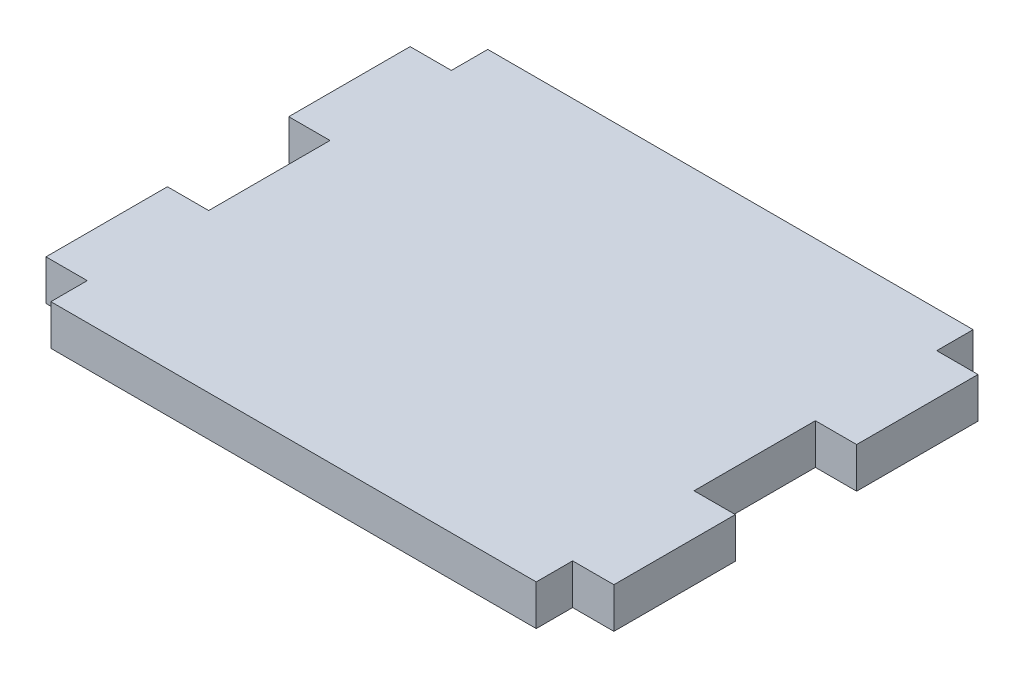
ISO-10303-21;
HEADER;
FILE_DESCRIPTION(('STEP AP214'),'2;1');
FILE_NAME('part.step','',(''),(''),'','','');
FILE_SCHEMA(('AUTOMOTIVE_DESIGN { 1 0 10303 214 1 1 1 1 }'));
ENDSEC;
DATA;
#1=APPLICATION_CONTEXT('core data for automotive mechanical design processes');
#2=APPLICATION_PROTOCOL_DEFINITION('international standard','automotive_design',2000,#1);
#3=PRODUCT_CONTEXT('',#1,'mechanical');
#4=PRODUCT('Part','Part','',(#3));
#5=PRODUCT_RELATED_PRODUCT_CATEGORY('part','',(#4));
#6=PRODUCT_DEFINITION_FORMATION('','',#4);
#7=PRODUCT_DEFINITION_CONTEXT('part definition',#1,'design');
#8=PRODUCT_DEFINITION('design','',#6,#7);
#9=PRODUCT_DEFINITION_SHAPE('','',#8);
#10=(LENGTH_UNIT() NAMED_UNIT(*) SI_UNIT(.MILLI.,.METRE.));
#11=(NAMED_UNIT(*) PLANE_ANGLE_UNIT() SI_UNIT($,.RADIAN.));
#12=(NAMED_UNIT(*) SI_UNIT($,.STERADIAN.) SOLID_ANGLE_UNIT());
#13=UNCERTAINTY_MEASURE_WITH_UNIT(LENGTH_MEASURE(1.E-05),#10,'distance_accuracy_value','');
#14=(GEOMETRIC_REPRESENTATION_CONTEXT(3) GLOBAL_UNCERTAINTY_ASSIGNED_CONTEXT((#13)) GLOBAL_UNIT_ASSIGNED_CONTEXT((#10,
#11,#12)) REPRESENTATION_CONTEXT('',''));
#15=CARTESIAN_POINT('',(0.,0.,0.));
#16=DIRECTION('',(0.,0.,1.));
#17=DIRECTION('',(1.,0.,0.));
#18=AXIS2_PLACEMENT_3D('',#15,#16,#17);
#19=CARTESIAN_POINT('',(70.2,0.,0.));
#20=DIRECTION('',(1.,0.,0.));
#21=DIRECTION('',(0.,0.,-1.));
#22=AXIS2_PLACEMENT_3D('',#19,#20,#21);
#23=PLANE('',#22);
#24=DIRECTION('',(0.,-1.,0.));
#25=VECTOR('',#24,1.);
#26=CARTESIAN_POINT('',(70.2,2.5,-7.50452554665607));
#27=LINE('',#26,#25);
#28=CARTESIAN_POINT('',(70.2,2.5,-7.50452554665607));
#29=VERTEX_POINT('',#28);
#30=CARTESIAN_POINT('',(70.2,-2.5,-7.50452554665607));
#31=VERTEX_POINT('',#30);
#32=EDGE_CURVE('E202',#29,#31,#27,.T.);
#33=ORIENTED_EDGE('',*,*,#32,.T.);
#34=DIRECTION('',(0.,0.,-1.));
#35=VECTOR('',#34,1.);
#36=CARTESIAN_POINT('',(70.2,-2.5,27.0045255466561));
#37=LINE('',#36,#35);
#38=CARTESIAN_POINT('',(70.2,-2.5,-22.5045255466561));
#39=VERTEX_POINT('',#38);
#40=EDGE_CURVE('E310',#31,#39,#37,.T.);
#41=ORIENTED_EDGE('',*,*,#40,.T.);
#42=DIRECTION('',(0.,-1.,0.));
#43=VECTOR('',#42,1.);
#44=CARTESIAN_POINT('',(70.2,2.5,-22.5045255466561));
#45=LINE('',#44,#43);
#46=CARTESIAN_POINT('',(70.2,2.5,-22.5045255466561));
#47=VERTEX_POINT('',#46);
#48=EDGE_CURVE('E183',#47,#39,#45,.T.);
#49=ORIENTED_EDGE('',*,*,#48,.F.);
#50=DIRECTION('',(0.,0.,1.));
#51=VECTOR('',#50,1.);
#52=CARTESIAN_POINT('',(70.2,2.5,27.0045255466561));
#53=LINE('',#52,#51);
#54=EDGE_CURVE('E197',#47,#29,#53,.T.);
#55=ORIENTED_EDGE('',*,*,#54,.T.);
#56=EDGE_LOOP('',(#33,#41,#49,#55));
#57=FACE_BOUND('',#56,.T.);
#58=ADVANCED_FACE('F36',(#57),#23,.T.);
#59=CARTESIAN_POINT('',(0.,0.,0.));
#60=DIRECTION('',(1.,0.,0.));
#61=DIRECTION('',(0.,0.,-1.));
#62=AXIS2_PLACEMENT_3D('',#59,#60,#61);
#63=PLANE('',#62);
#64=DIRECTION('',(0.,0.,-1.));
#65=VECTOR('',#64,1.);
#66=CARTESIAN_POINT('',(0.,-2.5,27.0045255466561));
#67=LINE('',#66,#65);
#68=CARTESIAN_POINT('',(0.,-2.5,-7.50452554665607));
#69=VERTEX_POINT('',#68);
#70=CARTESIAN_POINT('',(0.,-2.5,-22.5045255466561));
#71=VERTEX_POINT('',#70);
#72=EDGE_CURVE('E317',#69,#71,#67,.T.);
#73=ORIENTED_EDGE('',*,*,#72,.F.);
#74=DIRECTION('',(0.,-1.,0.));
#75=VECTOR('',#74,1.);
#76=CARTESIAN_POINT('',(0.,2.5,-7.50452554665607));
#77=LINE('',#76,#75);
#78=CARTESIAN_POINT('',(0.,2.5,-7.50452554665607));
#79=VERTEX_POINT('',#78);
#80=EDGE_CURVE('E268',#79,#69,#77,.T.);
#81=ORIENTED_EDGE('',*,*,#80,.F.);
#82=DIRECTION('',(0.,0.,1.));
#83=VECTOR('',#82,1.);
#84=CARTESIAN_POINT('',(0.,2.5,27.0045255466561));
#85=LINE('',#84,#83);
#86=CARTESIAN_POINT('',(0.,2.5,-22.5045255466561));
#87=VERTEX_POINT('',#86);
#88=EDGE_CURVE('E316',#87,#79,#85,.T.);
#89=ORIENTED_EDGE('',*,*,#88,.F.);
#90=DIRECTION('',(0.,-1.,0.));
#91=VECTOR('',#90,1.);
#92=CARTESIAN_POINT('',(0.,2.5,-22.5045255466561));
#93=LINE('',#92,#91);
#94=EDGE_CURVE('E244',#87,#71,#93,.T.);
#95=ORIENTED_EDGE('',*,*,#94,.T.);
#96=EDGE_LOOP('',(#73,#81,#89,#95));
#97=FACE_BOUND('',#96,.T.);
#98=ADVANCED_FACE('F375',(#97),#63,.F.);
#99=CARTESIAN_POINT('',(70.2,2.5,-27.0045255466561));
#100=DIRECTION('',(0.,0.,1.));
#101=DIRECTION('',(1.,0.,0.));
#102=AXIS2_PLACEMENT_3D('',#99,#100,#101);
#103=PLANE('',#102);
#104=DIRECTION('',(-1.,0.,0.));
#105=VECTOR('',#104,1.);
#106=CARTESIAN_POINT('',(70.2,-2.5,-27.0045255466561));
#107=LINE('',#106,#105);
#108=CARTESIAN_POINT('',(65.1,-2.5,-27.0045255466561));
#109=VERTEX_POINT('',#108);
#110=CARTESIAN_POINT('',(5.09999999999999,-2.5,-27.0045255466561));
#111=VERTEX_POINT('',#110);
#112=EDGE_CURVE('E320',#109,#111,#107,.T.);
#113=ORIENTED_EDGE('',*,*,#112,.T.);
#114=DIRECTION('',(0.,-1.,0.));
#115=VECTOR('',#114,1.);
#116=CARTESIAN_POINT('',(5.09999999999999,2.5,-27.0045255466561));
#117=LINE('',#116,#115);
#118=CARTESIAN_POINT('',(5.09999999999999,2.5,-27.0045255466561));
#119=VERTEX_POINT('',#118);
#120=EDGE_CURVE('E219',#119,#111,#117,.T.);
#121=ORIENTED_EDGE('',*,*,#120,.F.);
#122=DIRECTION('',(-1.,0.,0.));
#123=VECTOR('',#122,1.);
#124=CARTESIAN_POINT('',(70.2,2.5,-27.0045255466561));
#125=LINE('',#124,#123);
#126=CARTESIAN_POINT('',(65.1,2.5,-27.0045255466561));
#127=VERTEX_POINT('',#126);
#128=EDGE_CURVE('E11',#127,#119,#125,.T.);
#129=ORIENTED_EDGE('',*,*,#128,.F.);
#130=DIRECTION('',(0.,-1.,0.));
#131=VECTOR('',#130,1.);
#132=CARTESIAN_POINT('',(65.1,2.5,-27.0045255466561));
#133=LINE('',#132,#131);
#134=EDGE_CURVE('E182',#127,#109,#133,.T.);
#135=ORIENTED_EDGE('',*,*,#134,.T.);
#136=EDGE_LOOP('',(#113,#121,#129,#135));
#137=FACE_BOUND('',#136,.T.);
#138=ADVANCED_FACE('F38',(#137),#103,.F.);
#139=CARTESIAN_POINT('',(70.2,2.5,27.0045255466561));
#140=DIRECTION('',(0.,-1.,0.));
#141=DIRECTION('',(0.,0.,-1.));
#142=AXIS2_PLACEMENT_3D('',#139,#140,#141);
#143=PLANE('',#142);
#144=DIRECTION('',(1.,0.,0.));
#145=VECTOR('',#144,1.);
#146=CARTESIAN_POINT('',(5.09999999999999,2.5,22.5045255466561));
#147=LINE('',#146,#145);
#148=CARTESIAN_POINT('',(0.,2.5,22.5045255466561));
#149=VERTEX_POINT('',#148);
#150=CARTESIAN_POINT('',(5.09999999999999,2.5,22.5045255466561));
#151=VERTEX_POINT('',#150);
#152=EDGE_CURVE('E274',#149,#151,#147,.T.);
#153=ORIENTED_EDGE('',*,*,#152,.T.);
#154=DIRECTION('',(0.,0.,1.));
#155=VECTOR('',#154,1.);
#156=CARTESIAN_POINT('',(5.09999999999999,2.5,27.0045255466561));
#157=LINE('',#156,#155);
#158=CARTESIAN_POINT('',(5.09999999999999,2.5,27.0045255466561));
#159=VERTEX_POINT('',#158);
#160=EDGE_CURVE('E276',#151,#159,#157,.T.);
#161=ORIENTED_EDGE('',*,*,#160,.T.);
#162=DIRECTION('',(-1.,0.,0.));
#163=VECTOR('',#162,1.);
#164=CARTESIAN_POINT('',(70.2,2.5,27.0045255466561));
#165=LINE('',#164,#163);
#166=CARTESIAN_POINT('',(65.1,2.5,27.0045255466561));
#167=VERTEX_POINT('',#166);
#168=EDGE_CURVE('E44',#167,#159,#165,.T.);
#169=ORIENTED_EDGE('',*,*,#168,.F.);
#170=DIRECTION('',(0.,0.,-1.));
#171=VECTOR('',#170,1.);
#172=CARTESIAN_POINT('',(65.1,2.5,27.0045255466561));
#173=LINE('',#172,#171);
#174=CARTESIAN_POINT('',(65.1,2.5,22.5045255466561));
#175=VERTEX_POINT('',#174);
#176=EDGE_CURVE('E290',#167,#175,#173,.T.);
#177=ORIENTED_EDGE('',*,*,#176,.T.);
#178=DIRECTION('',(1.,0.,0.));
#179=VECTOR('',#178,1.);
#180=CARTESIAN_POINT('',(65.1,2.5,22.5045255466561));
#181=LINE('',#180,#179);
#182=CARTESIAN_POINT('',(70.2,2.5,22.5045255466561));
#183=VERTEX_POINT('',#182);
#184=EDGE_CURVE('E293',#175,#183,#181,.T.);
#185=ORIENTED_EDGE('',*,*,#184,.T.);
#186=CARTESIAN_POINT('',(70.2,2.5,7.49547445334393));
#187=VERTEX_POINT('',#186);
#188=EDGE_CURVE('E306',#187,#183,#53,.T.);
#189=ORIENTED_EDGE('',*,*,#188,.F.);
#190=DIRECTION('',(-1.,0.,0.));
#191=VECTOR('',#190,1.);
#192=CARTESIAN_POINT('',(70.2,2.5,7.49547445334393));
#193=LINE('',#192,#191);
#194=CARTESIAN_POINT('',(65.1,2.5,7.49547445334393));
#195=VERTEX_POINT('',#194);
#196=EDGE_CURVE('E59',#187,#195,#193,.T.);
#197=ORIENTED_EDGE('',*,*,#196,.T.);
#198=DIRECTION('',(0.,0.,-1.));
#199=VECTOR('',#198,1.);
#200=CARTESIAN_POINT('',(65.1,2.5,7.49547445334393));
#201=LINE('',#200,#199);
#202=CARTESIAN_POINT('',(65.1,2.5,-7.50452554665606));
#203=VERTEX_POINT('',#202);
#204=EDGE_CURVE('E208',#195,#203,#201,.T.);
#205=ORIENTED_EDGE('',*,*,#204,.T.);
#206=DIRECTION('',(1.,0.,0.));
#207=VECTOR('',#206,1.);
#208=CARTESIAN_POINT('',(65.1,2.5,-7.50452554665606));
#209=LINE('',#208,#207);
#210=EDGE_CURVE('E212',#203,#29,#209,.T.);
#211=ORIENTED_EDGE('',*,*,#210,.T.);
#212=ORIENTED_EDGE('',*,*,#54,.F.);
#213=DIRECTION('',(-1.,0.,0.));
#214=VECTOR('',#213,1.);
#215=CARTESIAN_POINT('',(65.1,2.5,-22.5045255466561));
#216=LINE('',#215,#214);
#217=CARTESIAN_POINT('',(65.1,2.5,-22.5045255466561));
#218=VERTEX_POINT('',#217);
#219=EDGE_CURVE('E176',#47,#218,#216,.T.);
#220=ORIENTED_EDGE('',*,*,#219,.T.);
#221=DIRECTION('',(0.,0.,-1.));
#222=VECTOR('',#221,1.);
#223=CARTESIAN_POINT('',(65.1,2.5,-27.0045255466561));
#224=LINE('',#223,#222);
#225=EDGE_CURVE('E186',#218,#127,#224,.T.);
#226=ORIENTED_EDGE('',*,*,#225,.T.);
#227=ORIENTED_EDGE('',*,*,#128,.T.);
#228=DIRECTION('',(0.,0.,1.));
#229=VECTOR('',#228,1.);
#230=CARTESIAN_POINT('',(5.09999999999999,2.5,-27.0045255466561));
#231=LINE('',#230,#229);
#232=CARTESIAN_POINT('',(5.09999999999999,2.5,-22.5045255466561));
#233=VERTEX_POINT('',#232);
#234=EDGE_CURVE('E230',#119,#233,#231,.T.);
#235=ORIENTED_EDGE('',*,*,#234,.T.);
#236=DIRECTION('',(-1.,0.,0.));
#237=VECTOR('',#236,1.);
#238=CARTESIAN_POINT('',(5.09999999999999,2.5,-22.5045255466561));
#239=LINE('',#238,#237);
#240=EDGE_CURVE('E233',#233,#87,#239,.T.);
#241=ORIENTED_EDGE('',*,*,#240,.T.);
#242=ORIENTED_EDGE('',*,*,#88,.T.);
#243=DIRECTION('',(1.,0.,0.));
#244=VECTOR('',#243,1.);
#245=CARTESIAN_POINT('',(5.09999999999999,2.5,-7.50452554665606));
#246=LINE('',#245,#244);
#247=CARTESIAN_POINT('',(5.09999999999999,2.5,-7.50452554665606));
#248=VERTEX_POINT('',#247);
#249=EDGE_CURVE('E255',#79,#248,#246,.T.);
#250=ORIENTED_EDGE('',*,*,#249,.T.);
#251=DIRECTION('',(0.,0.,1.));
#252=VECTOR('',#251,1.);
#253=CARTESIAN_POINT('',(5.09999999999999,2.5,7.49547445334393));
#254=LINE('',#253,#252);
#255=CARTESIAN_POINT('',(5.09999999999999,2.5,7.49547445334393));
#256=VERTEX_POINT('',#255);
#257=EDGE_CURVE('E248',#248,#256,#254,.T.);
#258=ORIENTED_EDGE('',*,*,#257,.T.);
#259=DIRECTION('',(-1.,0.,0.));
#260=VECTOR('',#259,1.);
#261=CARTESIAN_POINT('',(0.,2.5,7.49547445334393));
#262=LINE('',#261,#260);
#263=CARTESIAN_POINT('',(0.,2.5,7.49547445334393));
#264=VERTEX_POINT('',#263);
#265=EDGE_CURVE('E251',#256,#264,#262,.T.);
#266=ORIENTED_EDGE('',*,*,#265,.T.);
#267=EDGE_CURVE('E302',#264,#149,#85,.T.);
#268=ORIENTED_EDGE('',*,*,#267,.T.);
#269=EDGE_LOOP('',(#153,#161,#169,#177,#185,#189,#197,#205,#211,#212,#220,#226,#227,#235,#241,
#242,#250,#258,#266,#268));
#270=FACE_BOUND('',#269,.T.);
#271=ADVANCED_FACE('F194',(#270),#143,.F.);
#272=CARTESIAN_POINT('',(70.2,2.5,27.0045255466561));
#273=DIRECTION('',(0.,0.,-1.));
#274=DIRECTION('',(-1.,0.,0.));
#275=AXIS2_PLACEMENT_3D('',#272,#273,#274);
#276=PLANE('',#275);
#277=ORIENTED_EDGE('',*,*,#168,.T.);
#278=DIRECTION('',(0.,-1.,0.));
#279=VECTOR('',#278,1.);
#280=CARTESIAN_POINT('',(5.09999999999999,2.5,27.0045255466561));
#281=LINE('',#280,#279);
#282=CARTESIAN_POINT('',(5.09999999999999,-2.5,27.0045255466561));
#283=VERTEX_POINT('',#282);
#284=EDGE_CURVE('E263',#159,#283,#281,.T.);
#285=ORIENTED_EDGE('',*,*,#284,.T.);
#286=DIRECTION('',(-1.,0.,0.));
#287=VECTOR('',#286,1.);
#288=CARTESIAN_POINT('',(70.2,-2.5,27.0045255466561));
#289=LINE('',#288,#287);
#290=CARTESIAN_POINT('',(65.1,-2.5,27.0045255466561));
#291=VERTEX_POINT('',#290);
#292=EDGE_CURVE('E323',#291,#283,#289,.T.);
#293=ORIENTED_EDGE('',*,*,#292,.F.);
#294=DIRECTION('',(0.,-1.,0.));
#295=VECTOR('',#294,1.);
#296=CARTESIAN_POINT('',(65.1,2.5,27.0045255466561));
#297=LINE('',#296,#295);
#298=EDGE_CURVE('E296',#167,#291,#297,.T.);
#299=ORIENTED_EDGE('',*,*,#298,.F.);
#300=EDGE_LOOP('',(#277,#285,#293,#299));
#301=FACE_BOUND('',#300,.T.);
#302=ADVANCED_FACE('F329',(#301),#276,.F.);
#303=CARTESIAN_POINT('',(70.2,-2.5,27.0045255466561));
#304=DIRECTION('',(0.,1.,0.));
#305=DIRECTION('',(0.,0.,1.));
#306=AXIS2_PLACEMENT_3D('',#303,#304,#305);
#307=PLANE('',#306);
#308=ORIENTED_EDGE('',*,*,#292,.T.);
#309=DIRECTION('',(0.,0.,1.));
#310=VECTOR('',#309,1.);
#311=CARTESIAN_POINT('',(5.09999999999999,-2.5,27.0045255466561));
#312=LINE('',#311,#310);
#313=CARTESIAN_POINT('',(5.09999999999999,-2.5,22.5045255466561));
#314=VERTEX_POINT('',#313);
#315=EDGE_CURVE('E277',#314,#283,#312,.T.);
#316=ORIENTED_EDGE('',*,*,#315,.F.);
#317=DIRECTION('',(1.,0.,0.));
#318=VECTOR('',#317,1.);
#319=CARTESIAN_POINT('',(5.09999999999999,-2.5,22.5045255466561));
#320=LINE('',#319,#318);
#321=CARTESIAN_POINT('',(0.,-2.5,22.5045255466561));
#322=VERTEX_POINT('',#321);
#323=EDGE_CURVE('E281',#322,#314,#320,.T.);
#324=ORIENTED_EDGE('',*,*,#323,.F.);
#325=CARTESIAN_POINT('',(0.,-2.5,7.49547445334393));
#326=VERTEX_POINT('',#325);
#327=EDGE_CURVE('E309',#322,#326,#67,.T.);
#328=ORIENTED_EDGE('',*,*,#327,.T.);
#329=DIRECTION('',(-1.,0.,0.));
#330=VECTOR('',#329,1.);
#331=CARTESIAN_POINT('',(0.,-2.5,7.49547445334393));
#332=LINE('',#331,#330);
#333=CARTESIAN_POINT('',(5.09999999999999,-2.5,7.49547445334393));
#334=VERTEX_POINT('',#333);
#335=EDGE_CURVE('E262',#334,#326,#332,.T.);
#336=ORIENTED_EDGE('',*,*,#335,.F.);
#337=DIRECTION('',(0.,0.,1.));
#338=VECTOR('',#337,1.);
#339=CARTESIAN_POINT('',(5.09999999999999,-2.5,7.49547445334393));
#340=LINE('',#339,#338);
#341=CARTESIAN_POINT('',(5.09999999999999,-2.5,-7.50452554665606));
#342=VERTEX_POINT('',#341);
#343=EDGE_CURVE('E259',#342,#334,#340,.T.);
#344=ORIENTED_EDGE('',*,*,#343,.F.);
#345=DIRECTION('',(1.,0.,0.));
#346=VECTOR('',#345,1.);
#347=CARTESIAN_POINT('',(5.09999999999999,-2.5,-7.50452554665606));
#348=LINE('',#347,#346);
#349=EDGE_CURVE('E252',#69,#342,#348,.T.);
#350=ORIENTED_EDGE('',*,*,#349,.F.);
#351=ORIENTED_EDGE('',*,*,#72,.T.);
#352=DIRECTION('',(-1.,0.,0.));
#353=VECTOR('',#352,1.);
#354=CARTESIAN_POINT('',(5.09999999999999,-2.5,-22.5045255466561));
#355=LINE('',#354,#353);
#356=CARTESIAN_POINT('',(5.09999999999999,-2.5,-22.5045255466561));
#357=VERTEX_POINT('',#356);
#358=EDGE_CURVE('E234',#357,#71,#355,.T.);
#359=ORIENTED_EDGE('',*,*,#358,.F.);
#360=DIRECTION('',(0.,0.,1.));
#361=VECTOR('',#360,1.);
#362=CARTESIAN_POINT('',(5.09999999999999,-2.5,-27.0045255466561));
#363=LINE('',#362,#361);
#364=EDGE_CURVE('E238',#111,#357,#363,.T.);
#365=ORIENTED_EDGE('',*,*,#364,.F.);
#366=ORIENTED_EDGE('',*,*,#112,.F.);
#367=DIRECTION('',(0.,0.,-1.));
#368=VECTOR('',#367,1.);
#369=CARTESIAN_POINT('',(65.1,-2.5,-27.0045255466561));
#370=LINE('',#369,#368);
#371=CARTESIAN_POINT('',(65.1,-2.5,-22.5045255466561));
#372=VERTEX_POINT('',#371);
#373=EDGE_CURVE('E198',#372,#109,#370,.T.);
#374=ORIENTED_EDGE('',*,*,#373,.F.);
#375=DIRECTION('',(-1.,0.,0.));
#376=VECTOR('',#375,1.);
#377=CARTESIAN_POINT('',(65.1,-2.5,-22.5045255466561));
#378=LINE('',#377,#376);
#379=EDGE_CURVE('E179',#39,#372,#378,.T.);
#380=ORIENTED_EDGE('',*,*,#379,.F.);
#381=ORIENTED_EDGE('',*,*,#40,.F.);
#382=DIRECTION('',(1.,0.,0.));
#383=VECTOR('',#382,1.);
#384=CARTESIAN_POINT('',(65.1,-2.5,-7.50452554665606));
#385=LINE('',#384,#383);
#386=CARTESIAN_POINT('',(65.1,-2.5,-7.50452554665606));
#387=VERTEX_POINT('',#386);
#388=EDGE_CURVE('E209',#387,#31,#385,.T.);
#389=ORIENTED_EDGE('',*,*,#388,.F.);
#390=DIRECTION('',(0.,0.,-1.));
#391=VECTOR('',#390,1.);
#392=CARTESIAN_POINT('',(65.1,-2.5,7.49547445334393));
#393=LINE('',#392,#391);
#394=CARTESIAN_POINT('',(65.1,-2.5,7.49547445334393));
#395=VERTEX_POINT('',#394);
#396=EDGE_CURVE('E218',#395,#387,#393,.T.);
#397=ORIENTED_EDGE('',*,*,#396,.F.);
#398=DIRECTION('',(-1.,0.,0.));
#399=VECTOR('',#398,1.);
#400=CARTESIAN_POINT('',(70.2,-2.5,7.49547445334393));
#401=LINE('',#400,#399);
#402=CARTESIAN_POINT('',(70.2,-2.5,7.49547445334393));
#403=VERTEX_POINT('',#402);
#404=EDGE_CURVE('E215',#403,#395,#401,.T.);
#405=ORIENTED_EDGE('',*,*,#404,.F.);
#406=CARTESIAN_POINT('',(70.2,-2.5,22.5045255466561));
#407=VERTEX_POINT('',#406);
#408=EDGE_CURVE('E313',#407,#403,#37,.T.);
#409=ORIENTED_EDGE('',*,*,#408,.F.);
#410=DIRECTION('',(1.,0.,0.));
#411=VECTOR('',#410,1.);
#412=CARTESIAN_POINT('',(65.1,-2.5,22.5045255466561));
#413=LINE('',#412,#411);
#414=CARTESIAN_POINT('',(65.1,-2.5,22.5045255466561));
#415=VERTEX_POINT('',#414);
#416=EDGE_CURVE('E51',#415,#407,#413,.T.);
#417=ORIENTED_EDGE('',*,*,#416,.F.);
#418=DIRECTION('',(0.,0.,-1.));
#419=VECTOR('',#418,1.);
#420=CARTESIAN_POINT('',(65.1,-2.5,27.0045255466561));
#421=LINE('',#420,#419);
#422=EDGE_CURVE('E204',#291,#415,#421,.T.);
#423=ORIENTED_EDGE('',*,*,#422,.F.);
#424=EDGE_LOOP('',(#308,#316,#324,#328,#336,#344,#350,#351,#359,#365,#366,#374,#380,#381,#389,
#397,#405,#409,#417,#423));
#425=FACE_BOUND('',#424,.T.);
#426=ADVANCED_FACE('F337',(#425),#307,.F.);
#427=DIRECTION('',(0.,-1.,0.));
#428=VECTOR('',#427,1.);
#429=CARTESIAN_POINT('',(70.2,2.5,7.49547445334393));
#430=LINE('',#429,#428);
#431=EDGE_CURVE('E214',#187,#403,#430,.T.);
#432=ORIENTED_EDGE('',*,*,#431,.F.);
#433=ORIENTED_EDGE('',*,*,#188,.T.);
#434=DIRECTION('',(0.,-1.,0.));
#435=VECTOR('',#434,1.);
#436=CARTESIAN_POINT('',(70.2,2.5,22.5045255466561));
#437=LINE('',#436,#435);
#438=EDGE_CURVE('E300',#183,#407,#437,.T.);
#439=ORIENTED_EDGE('',*,*,#438,.T.);
#440=ORIENTED_EDGE('',*,*,#408,.T.);
#441=EDGE_LOOP('',(#432,#433,#439,#440));
#442=FACE_BOUND('',#441,.T.);
#443=ADVANCED_FACE('F348',(#442),#23,.T.);
#444=ORIENTED_EDGE('',*,*,#327,.F.);
#445=DIRECTION('',(0.,-1.,0.));
#446=VECTOR('',#445,1.);
#447=CARTESIAN_POINT('',(0.,2.5,22.5045255466561));
#448=LINE('',#447,#446);
#449=EDGE_CURVE('E280',#149,#322,#448,.T.);
#450=ORIENTED_EDGE('',*,*,#449,.F.);
#451=ORIENTED_EDGE('',*,*,#267,.F.);
#452=DIRECTION('',(0.,-1.,0.));
#453=VECTOR('',#452,1.);
#454=CARTESIAN_POINT('',(0.,2.5,7.49547445334393));
#455=LINE('',#454,#453);
#456=EDGE_CURVE('E270',#264,#326,#455,.T.);
#457=ORIENTED_EDGE('',*,*,#456,.T.);
#458=EDGE_LOOP('',(#444,#450,#451,#457));
#459=FACE_BOUND('',#458,.T.);
#460=ADVANCED_FACE('F390',(#459),#63,.F.);
#461=CARTESIAN_POINT('',(5.09999999999999,2.5,-27.0045255466561));
#462=DIRECTION('',(1.,0.,0.));
#463=DIRECTION('',(0.,0.,-1.));
#464=AXIS2_PLACEMENT_3D('',#461,#462,#463);
#465=PLANE('',#464);
#466=ORIENTED_EDGE('',*,*,#364,.T.);
#467=DIRECTION('',(0.,-1.,0.));
#468=VECTOR('',#467,1.);
#469=CARTESIAN_POINT('',(5.09999999999999,2.5,-22.5045255466561));
#470=LINE('',#469,#468);
#471=EDGE_CURVE('E237',#233,#357,#470,.T.);
#472=ORIENTED_EDGE('',*,*,#471,.F.);
#473=ORIENTED_EDGE('',*,*,#234,.F.);
#474=ORIENTED_EDGE('',*,*,#120,.T.);
#475=EDGE_LOOP('',(#466,#472,#473,#474));
#476=FACE_BOUND('',#475,.T.);
#477=ADVANCED_FACE('F369',(#476),#465,.F.);
#478=CARTESIAN_POINT('',(5.09999999999999,2.5,-22.5045255466561));
#479=DIRECTION('',(0.,0.,1.));
#480=DIRECTION('',(1.,0.,0.));
#481=AXIS2_PLACEMENT_3D('',#478,#479,#480);
#482=PLANE('',#481);
#483=ORIENTED_EDGE('',*,*,#358,.T.);
#484=ORIENTED_EDGE('',*,*,#94,.F.);
#485=ORIENTED_EDGE('',*,*,#240,.F.);
#486=ORIENTED_EDGE('',*,*,#471,.T.);
#487=EDGE_LOOP('',(#483,#484,#485,#486));
#488=FACE_BOUND('',#487,.T.);
#489=ADVANCED_FACE('F372',(#488),#482,.F.);
#490=CARTESIAN_POINT('',(5.09999999999999,2.5,7.49547445334393));
#491=DIRECTION('',(1.,0.,0.));
#492=DIRECTION('',(0.,0.,-1.));
#493=AXIS2_PLACEMENT_3D('',#490,#491,#492);
#494=PLANE('',#493);
#495=ORIENTED_EDGE('',*,*,#343,.T.);
#496=DIRECTION('',(0.,-1.,0.));
#497=VECTOR('',#496,1.);
#498=CARTESIAN_POINT('',(5.09999999999999,2.5,7.49547445334393));
#499=LINE('',#498,#497);
#500=EDGE_CURVE('E258',#256,#334,#499,.T.);
#501=ORIENTED_EDGE('',*,*,#500,.F.);
#502=ORIENTED_EDGE('',*,*,#257,.F.);
#503=DIRECTION('',(0.,-1.,0.));
#504=VECTOR('',#503,1.);
#505=CARTESIAN_POINT('',(5.09999999999999,2.5,-7.50452554665606));
#506=LINE('',#505,#504);
#507=EDGE_CURVE('E241',#248,#342,#506,.T.);
#508=ORIENTED_EDGE('',*,*,#507,.T.);
#509=EDGE_LOOP('',(#495,#501,#502,#508));
#510=FACE_BOUND('',#509,.T.);
#511=ADVANCED_FACE('F386',(#510),#494,.F.);
#512=CARTESIAN_POINT('',(5.09999999999999,2.5,-7.50452554665606));
#513=DIRECTION('',(0.,0.,-1.));
#514=DIRECTION('',(-1.,0.,0.));
#515=AXIS2_PLACEMENT_3D('',#512,#513,#514);
#516=PLANE('',#515);
#517=ORIENTED_EDGE('',*,*,#349,.T.);
#518=ORIENTED_EDGE('',*,*,#507,.F.);
#519=ORIENTED_EDGE('',*,*,#249,.F.);
#520=ORIENTED_EDGE('',*,*,#80,.T.);
#521=EDGE_LOOP('',(#517,#518,#519,#520));
#522=FACE_BOUND('',#521,.T.);
#523=ADVANCED_FACE('F381',(#522),#516,.F.);
#524=CARTESIAN_POINT('',(0.,2.5,7.49547445334393));
#525=DIRECTION('',(0.,0.,1.));
#526=DIRECTION('',(1.,0.,0.));
#527=AXIS2_PLACEMENT_3D('',#524,#525,#526);
#528=PLANE('',#527);
#529=ORIENTED_EDGE('',*,*,#335,.T.);
#530=ORIENTED_EDGE('',*,*,#456,.F.);
#531=ORIENTED_EDGE('',*,*,#265,.F.);
#532=ORIENTED_EDGE('',*,*,#500,.T.);
#533=EDGE_LOOP('',(#529,#530,#531,#532));
#534=FACE_BOUND('',#533,.T.);
#535=ADVANCED_FACE('F388',(#534),#528,.F.);
#536=CARTESIAN_POINT('',(5.09999999999999,2.5,27.0045255466561));
#537=DIRECTION('',(1.,0.,0.));
#538=DIRECTION('',(0.,0.,-1.));
#539=AXIS2_PLACEMENT_3D('',#536,#537,#538);
#540=PLANE('',#539);
#541=ORIENTED_EDGE('',*,*,#315,.T.);
#542=ORIENTED_EDGE('',*,*,#284,.F.);
#543=ORIENTED_EDGE('',*,*,#160,.F.);
#544=DIRECTION('',(0.,-1.,0.));
#545=VECTOR('',#544,1.);
#546=CARTESIAN_POINT('',(5.09999999999999,2.5,22.5045255466561));
#547=LINE('',#546,#545);
#548=EDGE_CURVE('E287',#151,#314,#547,.T.);
#549=ORIENTED_EDGE('',*,*,#548,.T.);
#550=EDGE_LOOP('',(#541,#542,#543,#549));
#551=FACE_BOUND('',#550,.T.);
#552=ADVANCED_FACE('F333',(#551),#540,.F.);
#553=CARTESIAN_POINT('',(5.09999999999999,2.5,22.5045255466561));
#554=DIRECTION('',(0.,0.,-1.));
#555=DIRECTION('',(-1.,0.,0.));
#556=AXIS2_PLACEMENT_3D('',#553,#554,#555);
#557=PLANE('',#556);
#558=ORIENTED_EDGE('',*,*,#323,.T.);
#559=ORIENTED_EDGE('',*,*,#548,.F.);
#560=ORIENTED_EDGE('',*,*,#152,.F.);
#561=ORIENTED_EDGE('',*,*,#449,.T.);
#562=EDGE_LOOP('',(#558,#559,#560,#561));
#563=FACE_BOUND('',#562,.T.);
#564=ADVANCED_FACE('F393',(#563),#557,.F.);
#565=CARTESIAN_POINT('',(65.1,2.5,22.5045255466561));
#566=DIRECTION('',(0.,0.,-1.));
#567=DIRECTION('',(-1.,0.,0.));
#568=AXIS2_PLACEMENT_3D('',#565,#566,#567);
#569=PLANE('',#568);
#570=ORIENTED_EDGE('',*,*,#416,.T.);
#571=ORIENTED_EDGE('',*,*,#438,.F.);
#572=ORIENTED_EDGE('',*,*,#184,.F.);
#573=DIRECTION('',(0.,-1.,0.));
#574=VECTOR('',#573,1.);
#575=CARTESIAN_POINT('',(65.1,2.5,22.5045255466561));
#576=LINE('',#575,#574);
#577=EDGE_CURVE('E303',#175,#415,#576,.T.);
#578=ORIENTED_EDGE('',*,*,#577,.T.);
#579=EDGE_LOOP('',(#570,#571,#572,#578));
#580=FACE_BOUND('',#579,.T.);
#581=ADVANCED_FACE('F345',(#580),#569,.F.);
#582=CARTESIAN_POINT('',(65.1,2.5,27.0045255466561));
#583=DIRECTION('',(-1.,0.,0.));
#584=DIRECTION('',(0.,0.,1.));
#585=AXIS2_PLACEMENT_3D('',#582,#583,#584);
#586=PLANE('',#585);
#587=ORIENTED_EDGE('',*,*,#422,.T.);
#588=ORIENTED_EDGE('',*,*,#577,.F.);
#589=ORIENTED_EDGE('',*,*,#176,.F.);
#590=ORIENTED_EDGE('',*,*,#298,.T.);
#591=EDGE_LOOP('',(#587,#588,#589,#590));
#592=FACE_BOUND('',#591,.T.);
#593=ADVANCED_FACE('F343',(#592),#586,.F.);
#594=CARTESIAN_POINT('',(65.1,2.5,-27.0045255466561));
#595=DIRECTION('',(-1.,0.,0.));
#596=DIRECTION('',(0.,0.,1.));
#597=AXIS2_PLACEMENT_3D('',#594,#595,#596);
#598=PLANE('',#597);
#599=ORIENTED_EDGE('',*,*,#373,.T.);
#600=ORIENTED_EDGE('',*,*,#134,.F.);
#601=ORIENTED_EDGE('',*,*,#225,.F.);
#602=DIRECTION('',(0.,-1.,0.));
#603=VECTOR('',#602,1.);
#604=CARTESIAN_POINT('',(65.1,2.5,-22.5045255466561));
#605=LINE('',#604,#603);
#606=EDGE_CURVE('E172',#218,#372,#605,.T.);
#607=ORIENTED_EDGE('',*,*,#606,.T.);
#608=EDGE_LOOP('',(#599,#600,#601,#607));
#609=FACE_BOUND('',#608,.T.);
#610=ADVANCED_FACE('F187',(#609),#598,.F.);
#611=CARTESIAN_POINT('',(65.1,2.5,-22.5045255466561));
#612=DIRECTION('',(0.,0.,1.));
#613=DIRECTION('',(1.,0.,0.));
#614=AXIS2_PLACEMENT_3D('',#611,#612,#613);
#615=PLANE('',#614);
#616=ORIENTED_EDGE('',*,*,#379,.T.);
#617=ORIENTED_EDGE('',*,*,#606,.F.);
#618=ORIENTED_EDGE('',*,*,#219,.F.);
#619=ORIENTED_EDGE('',*,*,#48,.T.);
#620=EDGE_LOOP('',(#616,#617,#618,#619));
#621=FACE_BOUND('',#620,.T.);
#622=ADVANCED_FACE('F174',(#621),#615,.F.);
#623=CARTESIAN_POINT('',(65.1,2.5,-7.50452554665606));
#624=DIRECTION('',(0.,0.,-1.));
#625=DIRECTION('',(-1.,0.,0.));
#626=AXIS2_PLACEMENT_3D('',#623,#624,#625);
#627=PLANE('',#626);
#628=ORIENTED_EDGE('',*,*,#388,.T.);
#629=ORIENTED_EDGE('',*,*,#32,.F.);
#630=ORIENTED_EDGE('',*,*,#210,.F.);
#631=DIRECTION('',(0.,-1.,0.));
#632=VECTOR('',#631,1.);
#633=CARTESIAN_POINT('',(65.1,2.5,-7.50452554665606));
#634=LINE('',#633,#632);
#635=EDGE_CURVE('E225',#203,#387,#634,.T.);
#636=ORIENTED_EDGE('',*,*,#635,.T.);
#637=EDGE_LOOP('',(#628,#629,#630,#636));
#638=FACE_BOUND('',#637,.T.);
#639=ADVANCED_FACE('F507',(#638),#627,.F.);
#640=CARTESIAN_POINT('',(65.1,2.5,7.49547445334393));
#641=DIRECTION('',(-1.,0.,0.));
#642=DIRECTION('',(0.,0.,1.));
#643=AXIS2_PLACEMENT_3D('',#640,#641,#642);
#644=PLANE('',#643);
#645=ORIENTED_EDGE('',*,*,#396,.T.);
#646=ORIENTED_EDGE('',*,*,#635,.F.);
#647=ORIENTED_EDGE('',*,*,#204,.F.);
#648=DIRECTION('',(0.,-1.,0.));
#649=VECTOR('',#648,1.);
#650=CARTESIAN_POINT('',(65.1,2.5,7.49547445334393));
#651=LINE('',#650,#649);
#652=EDGE_CURVE('E227',#195,#395,#651,.T.);
#653=ORIENTED_EDGE('',*,*,#652,.T.);
#654=EDGE_LOOP('',(#645,#646,#647,#653));
#655=FACE_BOUND('',#654,.T.);
#656=ADVANCED_FACE('F356',(#655),#644,.F.);
#657=CARTESIAN_POINT('',(70.2,2.5,7.49547445334393));
#658=DIRECTION('',(0.,0.,1.));
#659=DIRECTION('',(1.,0.,0.));
#660=AXIS2_PLACEMENT_3D('',#657,#658,#659);
#661=PLANE('',#660);
#662=ORIENTED_EDGE('',*,*,#404,.T.);
#663=ORIENTED_EDGE('',*,*,#652,.F.);
#664=ORIENTED_EDGE('',*,*,#196,.F.);
#665=ORIENTED_EDGE('',*,*,#431,.T.);
#666=EDGE_LOOP('',(#662,#663,#664,#665));
#667=FACE_BOUND('',#666,.T.);
#668=ADVANCED_FACE('F351',(#667),#661,.F.);
#669=CLOSED_SHELL('',(#58,#98,#138,#271,#302,#426,#443,#460,#477,#489,#511,#523,#535,#552,#564,
#581,#593,#610,#622,#639,#656,#668));
#670=MANIFOLD_SOLID_BREP('B2',#669);
#671=ADVANCED_BREP_SHAPE_REPRESENTATION('',(#18,#670),#14);
#672=SHAPE_DEFINITION_REPRESENTATION(#9,#671);
ENDSEC;
END-ISO-10303-21;
